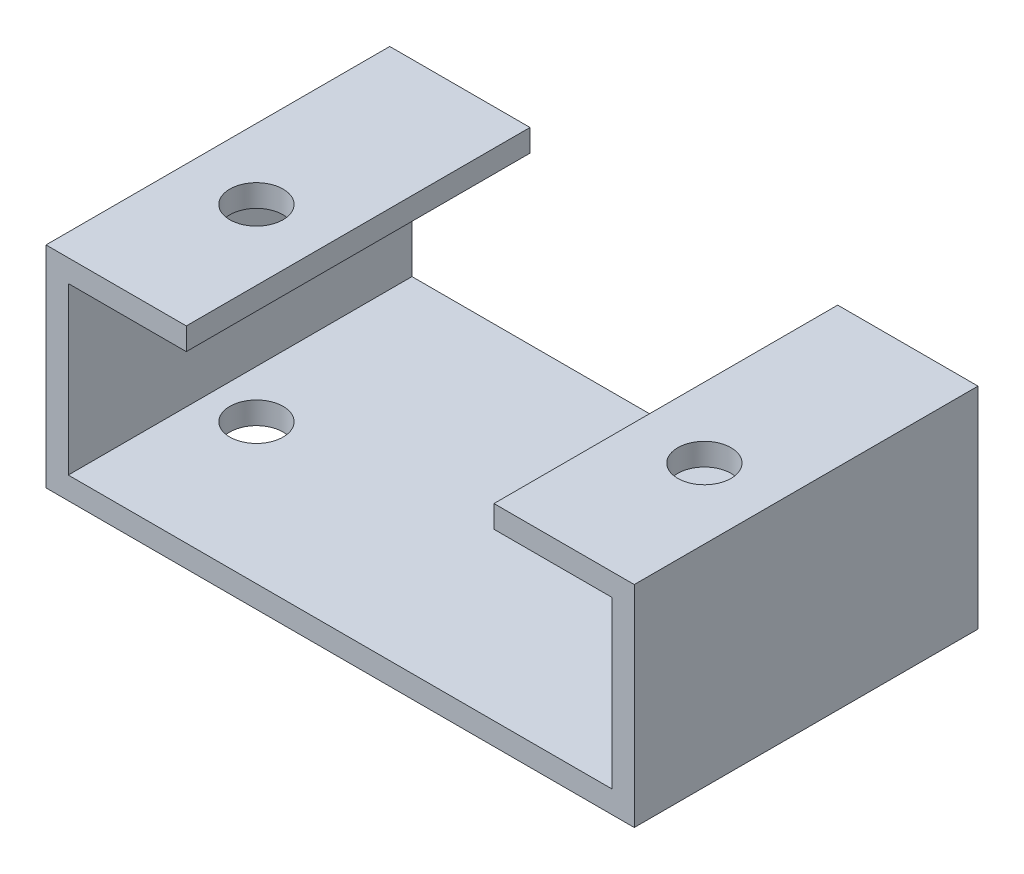
ISO-10303-21;
HEADER;
FILE_DESCRIPTION(('STEP AP214'),'2;1');
FILE_NAME('part.step','',(''),(''),'','','');
FILE_SCHEMA(('AUTOMOTIVE_DESIGN { 1 0 10303 214 1 1 1 1 }'));
ENDSEC;
DATA;
#1=APPLICATION_CONTEXT('core data for automotive mechanical design processes');
#2=APPLICATION_PROTOCOL_DEFINITION('international standard','automotive_design',2000,#1);
#3=PRODUCT_CONTEXT('',#1,'mechanical');
#4=PRODUCT('Part','Part','',(#3));
#5=PRODUCT_RELATED_PRODUCT_CATEGORY('part','',(#4));
#6=PRODUCT_DEFINITION_FORMATION('','',#4);
#7=PRODUCT_DEFINITION_CONTEXT('part definition',#1,'design');
#8=PRODUCT_DEFINITION('design','',#6,#7);
#9=PRODUCT_DEFINITION_SHAPE('','',#8);
#10=(LENGTH_UNIT() NAMED_UNIT(*) SI_UNIT(.MILLI.,.METRE.));
#11=(NAMED_UNIT(*) PLANE_ANGLE_UNIT() SI_UNIT($,.RADIAN.));
#12=(NAMED_UNIT(*) SI_UNIT($,.STERADIAN.) SOLID_ANGLE_UNIT());
#13=UNCERTAINTY_MEASURE_WITH_UNIT(LENGTH_MEASURE(1.E-05),#10,'distance_accuracy_value','');
#14=(GEOMETRIC_REPRESENTATION_CONTEXT(3) GLOBAL_UNCERTAINTY_ASSIGNED_CONTEXT((#13)) GLOBAL_UNIT_ASSIGNED_CONTEXT((#10,
#11,#12)) REPRESENTATION_CONTEXT('',''));
#15=CARTESIAN_POINT('',(0.,0.,0.));
#16=DIRECTION('',(0.,0.,1.));
#17=DIRECTION('',(1.,0.,0.));
#18=AXIS2_PLACEMENT_3D('',#15,#16,#17);
#19=CARTESIAN_POINT('',(20.965,0.,-14.5));
#20=DIRECTION('',(0.,-1.,0.));
#21=DIRECTION('',(1.,0.,0.));
#22=AXIS2_PLACEMENT_3D('',#19,#20,#21);
#23=PLANE('',#22);
#24=CARTESIAN_POINT('',(36.93,0.,0.));
#25=DIRECTION('',(0.,-1.,0.));
#26=DIRECTION('',(0.,0.,-1.));
#27=AXIS2_PLACEMENT_3D('',#24,#25,#26);
#28=CIRCLE('',#27,1.89864999999999);
#29=CARTESIAN_POINT('',(36.93,0.,-1.89864999999999));
#30=VERTEX_POINT('',#29);
#31=EDGE_CURVE('E312',#30,#30,#28,.T.);
#32=ORIENTED_EDGE('',*,*,#31,.F.);
#33=EDGE_LOOP('',(#32));
#34=FACE_BOUND('',#33,.T.);
#35=CARTESIAN_POINT('',(5.,0.,0.));
#36=DIRECTION('',(0.,-1.,0.));
#37=DIRECTION('',(0.,0.,-1.));
#38=AXIS2_PLACEMENT_3D('',#35,#36,#37);
#39=CIRCLE('',#38,1.89864999999999);
#40=CARTESIAN_POINT('',(5.,0.,-1.89864999999999));
#41=VERTEX_POINT('',#40);
#42=EDGE_CURVE('E175',#41,#41,#39,.T.);
#43=ORIENTED_EDGE('',*,*,#42,.F.);
#44=EDGE_LOOP('',(#43));
#45=FACE_BOUND('',#44,.T.);
#46=DIRECTION('',(1.,0.,0.));
#47=VECTOR('',#46,1.);
#48=CARTESIAN_POINT('',(20.965,0.,-14.5));
#49=LINE('',#48,#47);
#50=CARTESIAN_POINT('',(0.,0.,-14.5));
#51=VERTEX_POINT('',#50);
#52=CARTESIAN_POINT('',(41.93,0.,-14.5));
#53=VERTEX_POINT('',#52);
#54=EDGE_CURVE('E137',#51,#53,#49,.T.);
#55=ORIENTED_EDGE('',*,*,#54,.T.);
#56=DIRECTION('',(0.,0.,1.));
#57=VECTOR('',#56,1.);
#58=CARTESIAN_POINT('',(41.93,0.,-14.5));
#59=LINE('',#58,#57);
#60=CARTESIAN_POINT('',(41.93,0.,10.));
#61=VERTEX_POINT('',#60);
#62=EDGE_CURVE('E135',#53,#61,#59,.T.);
#63=ORIENTED_EDGE('',*,*,#62,.T.);
#64=DIRECTION('',(1.,0.,0.));
#65=VECTOR('',#64,1.);
#66=CARTESIAN_POINT('',(20.965,0.,10.));
#67=LINE('',#66,#65);
#68=CARTESIAN_POINT('',(0.,0.,10.));
#69=VERTEX_POINT('',#68);
#70=EDGE_CURVE('E123',#69,#61,#67,.T.);
#71=ORIENTED_EDGE('',*,*,#70,.F.);
#72=DIRECTION('',(0.,0.,1.));
#73=VECTOR('',#72,1.);
#74=CARTESIAN_POINT('',(0.,0.,-14.5));
#75=LINE('',#74,#73);
#76=EDGE_CURVE('E11',#51,#69,#75,.T.);
#77=ORIENTED_EDGE('',*,*,#76,.F.);
#78=EDGE_LOOP('',(#55,#63,#71,#77));
#79=FACE_BOUND('',#78,.T.);
#80=ADVANCED_FACE('F35',(#34,#45,#79),#23,.T.);
#81=CARTESIAN_POINT('',(0.,0.,-14.5));
#82=DIRECTION('',(-1.,0.,0.));
#83=DIRECTION('',(0.,0.,1.));
#84=AXIS2_PLACEMENT_3D('',#81,#82,#83);
#85=PLANE('',#84);
#86=ORIENTED_EDGE('',*,*,#76,.T.);
#87=DIRECTION('',(0.,-1.,0.));
#88=VECTOR('',#87,1.);
#89=CARTESIAN_POINT('',(0.,0.,10.));
#90=LINE('',#89,#88);
#91=CARTESIAN_POINT('',(0.,15.,10.));
#92=VERTEX_POINT('',#91);
#93=EDGE_CURVE('E131',#92,#69,#90,.T.);
#94=ORIENTED_EDGE('',*,*,#93,.F.);
#95=DIRECTION('',(0.,0.,1.));
#96=VECTOR('',#95,1.);
#97=CARTESIAN_POINT('',(0.,15.,-14.5));
#98=LINE('',#97,#96);
#99=CARTESIAN_POINT('',(0.,15.,-14.5));
#100=VERTEX_POINT('',#99);
#101=EDGE_CURVE('E44',#100,#92,#98,.T.);
#102=ORIENTED_EDGE('',*,*,#101,.F.);
#103=DIRECTION('',(0.,-1.,0.));
#104=VECTOR('',#103,1.);
#105=CARTESIAN_POINT('',(0.,0.,-14.5));
#106=LINE('',#105,#104);
#107=EDGE_CURVE('E223',#100,#51,#106,.T.);
#108=ORIENTED_EDGE('',*,*,#107,.T.);
#109=EDGE_LOOP('',(#86,#94,#102,#108));
#110=FACE_BOUND('',#109,.T.);
#111=ADVANCED_FACE('F256',(#110),#85,.T.);
#112=CARTESIAN_POINT('',(0.,15.,-14.5));
#113=DIRECTION('',(0.,1.,0.));
#114=DIRECTION('',(0.,0.,1.));
#115=AXIS2_PLACEMENT_3D('',#112,#113,#114);
#116=PLANE('',#115);
#117=CARTESIAN_POINT('',(5.,15.,0.));
#118=DIRECTION('',(0.,-1.,0.));
#119=DIRECTION('',(0.,0.,-1.));
#120=AXIS2_PLACEMENT_3D('',#117,#118,#119);
#121=CIRCLE('',#120,1.89865);
#122=CARTESIAN_POINT('',(5.,15.,-1.89865));
#123=VERTEX_POINT('',#122);
#124=EDGE_CURVE('E185',#123,#123,#121,.T.);
#125=ORIENTED_EDGE('',*,*,#124,.T.);
#126=EDGE_LOOP('',(#125));
#127=FACE_BOUND('',#126,.T.);
#128=ORIENTED_EDGE('',*,*,#101,.T.);
#129=DIRECTION('',(-1.,0.,0.));
#130=VECTOR('',#129,1.);
#131=CARTESIAN_POINT('',(0.,15.,10.));
#132=LINE('',#131,#130);
#133=CARTESIAN_POINT('',(10.,15.,10.));
#134=VERTEX_POINT('',#133);
#135=EDGE_CURVE('E206',#134,#92,#132,.T.);
#136=ORIENTED_EDGE('',*,*,#135,.F.);
#137=DIRECTION('',(0.,0.,1.));
#138=VECTOR('',#137,1.);
#139=CARTESIAN_POINT('',(10.,15.,-14.5));
#140=LINE('',#139,#138);
#141=CARTESIAN_POINT('',(10.,15.,-14.5));
#142=VERTEX_POINT('',#141);
#143=EDGE_CURVE('E228',#142,#134,#140,.T.);
#144=ORIENTED_EDGE('',*,*,#143,.F.);
#145=DIRECTION('',(-1.,0.,0.));
#146=VECTOR('',#145,1.);
#147=CARTESIAN_POINT('',(0.,15.,-14.5));
#148=LINE('',#147,#146);
#149=EDGE_CURVE('E220',#142,#100,#148,.T.);
#150=ORIENTED_EDGE('',*,*,#149,.T.);
#151=EDGE_LOOP('',(#128,#136,#144,#150));
#152=FACE_BOUND('',#151,.T.);
#153=ADVANCED_FACE('F254',(#127,#152),#116,.T.);
#154=CARTESIAN_POINT('',(10.,15.,-14.5));
#155=DIRECTION('',(1.,0.,0.));
#156=DIRECTION('',(0.,0.,-1.));
#157=AXIS2_PLACEMENT_3D('',#154,#155,#156);
#158=PLANE('',#157);
#159=ORIENTED_EDGE('',*,*,#143,.T.);
#160=DIRECTION('',(0.,1.,0.));
#161=VECTOR('',#160,1.);
#162=CARTESIAN_POINT('',(10.,15.,10.));
#163=LINE('',#162,#161);
#164=CARTESIAN_POINT('',(10.,13.4125,10.));
#165=VERTEX_POINT('',#164);
#166=EDGE_CURVE('E203',#165,#134,#163,.T.);
#167=ORIENTED_EDGE('',*,*,#166,.F.);
#168=DIRECTION('',(0.,0.,1.));
#169=VECTOR('',#168,1.);
#170=CARTESIAN_POINT('',(10.,13.4125,-14.5));
#171=LINE('',#170,#169);
#172=CARTESIAN_POINT('',(10.,13.4125,-14.5));
#173=VERTEX_POINT('',#172);
#174=EDGE_CURVE('E230',#173,#165,#171,.T.);
#175=ORIENTED_EDGE('',*,*,#174,.F.);
#176=DIRECTION('',(0.,1.,0.));
#177=VECTOR('',#176,1.);
#178=CARTESIAN_POINT('',(10.,15.,-14.5));
#179=LINE('',#178,#177);
#180=EDGE_CURVE('E217',#173,#142,#179,.T.);
#181=ORIENTED_EDGE('',*,*,#180,.T.);
#182=EDGE_LOOP('',(#159,#167,#175,#181));
#183=FACE_BOUND('',#182,.T.);
#184=ADVANCED_FACE('F250',(#183),#158,.T.);
#185=CARTESIAN_POINT('',(1.5875,13.4125,-14.5));
#186=DIRECTION('',(0.,-1.,0.));
#187=DIRECTION('',(0.,0.,-1.));
#188=AXIS2_PLACEMENT_3D('',#185,#186,#187);
#189=PLANE('',#188);
#190=CARTESIAN_POINT('',(5.,13.4125,0.));
#191=DIRECTION('',(0.,-1.,0.));
#192=DIRECTION('',(0.,0.,-1.));
#193=AXIS2_PLACEMENT_3D('',#190,#191,#192);
#194=CIRCLE('',#193,1.89864999999999);
#195=CARTESIAN_POINT('',(5.,13.4125,-1.89864999999999));
#196=VERTEX_POINT('',#195);
#197=EDGE_CURVE('E191',#196,#196,#194,.T.);
#198=ORIENTED_EDGE('',*,*,#197,.F.);
#199=EDGE_LOOP('',(#198));
#200=FACE_BOUND('',#199,.T.);
#201=ORIENTED_EDGE('',*,*,#174,.T.);
#202=DIRECTION('',(1.,0.,0.));
#203=VECTOR('',#202,1.);
#204=CARTESIAN_POINT('',(1.5875,13.4125,10.));
#205=LINE('',#204,#203);
#206=CARTESIAN_POINT('',(1.5875,13.4125,10.));
#207=VERTEX_POINT('',#206);
#208=EDGE_CURVE('E200',#207,#165,#205,.T.);
#209=ORIENTED_EDGE('',*,*,#208,.F.);
#210=DIRECTION('',(0.,0.,1.));
#211=VECTOR('',#210,1.);
#212=CARTESIAN_POINT('',(1.5875,13.4125,-14.5));
#213=LINE('',#212,#211);
#214=CARTESIAN_POINT('',(1.5875,13.4125,-14.5));
#215=VERTEX_POINT('',#214);
#216=EDGE_CURVE('E232',#215,#207,#213,.T.);
#217=ORIENTED_EDGE('',*,*,#216,.F.);
#218=DIRECTION('',(1.,0.,0.));
#219=VECTOR('',#218,1.);
#220=CARTESIAN_POINT('',(1.5875,13.4125,-14.5));
#221=LINE('',#220,#219);
#222=EDGE_CURVE('E214',#215,#173,#221,.T.);
#223=ORIENTED_EDGE('',*,*,#222,.T.);
#224=EDGE_LOOP('',(#201,#209,#217,#223));
#225=FACE_BOUND('',#224,.T.);
#226=ADVANCED_FACE('F244',(#200,#225),#189,.T.);
#227=CARTESIAN_POINT('',(1.5875,1.5875,-14.5));
#228=DIRECTION('',(1.,0.,0.));
#229=DIRECTION('',(0.,0.,-1.));
#230=AXIS2_PLACEMENT_3D('',#227,#228,#229);
#231=PLANE('',#230);
#232=ORIENTED_EDGE('',*,*,#216,.T.);
#233=DIRECTION('',(0.,1.,0.));
#234=VECTOR('',#233,1.);
#235=CARTESIAN_POINT('',(1.5875,1.5875,10.));
#236=LINE('',#235,#234);
#237=CARTESIAN_POINT('',(1.5875,1.5875,10.));
#238=VERTEX_POINT('',#237);
#239=EDGE_CURVE('E197',#238,#207,#236,.T.);
#240=ORIENTED_EDGE('',*,*,#239,.F.);
#241=DIRECTION('',(0.,0.,1.));
#242=VECTOR('',#241,1.);
#243=CARTESIAN_POINT('',(1.5875,1.5875,-14.5));
#244=LINE('',#243,#242);
#245=CARTESIAN_POINT('',(1.5875,1.5875,-14.5));
#246=VERTEX_POINT('',#245);
#247=EDGE_CURVE('E225',#246,#238,#244,.T.);
#248=ORIENTED_EDGE('',*,*,#247,.F.);
#249=DIRECTION('',(0.,1.,0.));
#250=VECTOR('',#249,1.);
#251=CARTESIAN_POINT('',(1.5875,1.5875,-14.5));
#252=LINE('',#251,#250);
#253=EDGE_CURVE('E211',#246,#215,#252,.T.);
#254=ORIENTED_EDGE('',*,*,#253,.T.);
#255=EDGE_LOOP('',(#232,#240,#248,#254));
#256=FACE_BOUND('',#255,.T.);
#257=ADVANCED_FACE('F241',(#256),#231,.T.);
#258=CARTESIAN_POINT('',(20.965,1.5875,-14.5));
#259=DIRECTION('',(0.,1.,0.));
#260=DIRECTION('',(-1.,0.,0.));
#261=AXIS2_PLACEMENT_3D('',#258,#259,#260);
#262=PLANE('',#261);
#263=CARTESIAN_POINT('',(36.93,1.5875,0.));
#264=DIRECTION('',(0.,1.,0.));
#265=DIRECTION('',(-1.,0.,0.));
#266=AXIS2_PLACEMENT_3D('',#263,#264,#265);
#267=CIRCLE('',#266,1.89864999999999);
#268=CARTESIAN_POINT('',(35.03135,1.5875,0.));
#269=VERTEX_POINT('',#268);
#270=EDGE_CURVE('E39',#269,#269,#267,.T.);
#271=ORIENTED_EDGE('',*,*,#270,.F.);
#272=EDGE_LOOP('',(#271));
#273=FACE_BOUND('',#272,.T.);
#274=CARTESIAN_POINT('',(5.,1.5875,0.));
#275=DIRECTION('',(0.,1.,0.));
#276=DIRECTION('',(-1.,0.,0.));
#277=AXIS2_PLACEMENT_3D('',#274,#275,#276);
#278=CIRCLE('',#277,1.89864999999999);
#279=CARTESIAN_POINT('',(3.10135000000001,1.5875,0.));
#280=VERTEX_POINT('',#279);
#281=EDGE_CURVE('E188',#280,#280,#278,.T.);
#282=ORIENTED_EDGE('',*,*,#281,.F.);
#283=EDGE_LOOP('',(#282));
#284=FACE_BOUND('',#283,.T.);
#285=ORIENTED_EDGE('',*,*,#247,.T.);
#286=DIRECTION('',(-1.,0.,0.));
#287=VECTOR('',#286,1.);
#288=CARTESIAN_POINT('',(20.965,1.5875,10.));
#289=LINE('',#288,#287);
#290=CARTESIAN_POINT('',(40.3425,1.5875,10.));
#291=VERTEX_POINT('',#290);
#292=EDGE_CURVE('E194',#291,#238,#289,.T.);
#293=ORIENTED_EDGE('',*,*,#292,.F.);
#294=DIRECTION('',(0.,0.,1.));
#295=VECTOR('',#294,1.);
#296=CARTESIAN_POINT('',(40.3425,1.5875,-14.5));
#297=LINE('',#296,#295);
#298=CARTESIAN_POINT('',(40.3425,1.5875,-14.5));
#299=VERTEX_POINT('',#298);
#300=EDGE_CURVE('E172',#299,#291,#297,.T.);
#301=ORIENTED_EDGE('',*,*,#300,.F.);
#302=DIRECTION('',(-1.,0.,0.));
#303=VECTOR('',#302,1.);
#304=CARTESIAN_POINT('',(20.965,1.5875,-14.5));
#305=LINE('',#304,#303);
#306=EDGE_CURVE('E132',#299,#246,#305,.T.);
#307=ORIENTED_EDGE('',*,*,#306,.T.);
#308=EDGE_LOOP('',(#285,#293,#301,#307));
#309=FACE_BOUND('',#308,.T.);
#310=ADVANCED_FACE('F37',(#273,#284,#309),#262,.T.);
#311=CARTESIAN_POINT('',(0.,0.,-14.5));
#312=DIRECTION('',(0.,0.,-1.));
#313=DIRECTION('',(-1.,0.,0.));
#314=AXIS2_PLACEMENT_3D('',#311,#312,#313);
#315=PLANE('',#314);
#316=ORIENTED_EDGE('',*,*,#306,.F.);
#317=DIRECTION('',(0.,1.,0.));
#318=VECTOR('',#317,1.);
#319=CARTESIAN_POINT('',(40.3425,1.5875,-14.5));
#320=LINE('',#319,#318);
#321=CARTESIAN_POINT('',(40.3425,13.4125,-14.5));
#322=VERTEX_POINT('',#321);
#323=EDGE_CURVE('E142',#299,#322,#320,.T.);
#324=ORIENTED_EDGE('',*,*,#323,.T.);
#325=DIRECTION('',(-1.,0.,0.));
#326=VECTOR('',#325,1.);
#327=CARTESIAN_POINT('',(40.3425,13.4125,-14.5));
#328=LINE('',#327,#326);
#329=CARTESIAN_POINT('',(31.93,13.4125,-14.5));
#330=VERTEX_POINT('',#329);
#331=EDGE_CURVE('E169',#322,#330,#328,.T.);
#332=ORIENTED_EDGE('',*,*,#331,.T.);
#333=DIRECTION('',(0.,1.,0.));
#334=VECTOR('',#333,1.);
#335=CARTESIAN_POINT('',(31.93,15.,-14.5));
#336=LINE('',#335,#334);
#337=CARTESIAN_POINT('',(31.93,15.,-14.5));
#338=VERTEX_POINT('',#337);
#339=EDGE_CURVE('E167',#330,#338,#336,.T.);
#340=ORIENTED_EDGE('',*,*,#339,.T.);
#341=DIRECTION('',(1.,0.,0.));
#342=VECTOR('',#341,1.);
#343=CARTESIAN_POINT('',(41.93,15.,-14.5));
#344=LINE('',#343,#342);
#345=CARTESIAN_POINT('',(41.93,15.,-14.5));
#346=VERTEX_POINT('',#345);
#347=EDGE_CURVE('E165',#338,#346,#344,.T.);
#348=ORIENTED_EDGE('',*,*,#347,.T.);
#349=DIRECTION('',(0.,-1.,0.));
#350=VECTOR('',#349,1.);
#351=CARTESIAN_POINT('',(41.93,0.,-14.5));
#352=LINE('',#351,#350);
#353=EDGE_CURVE('E163',#346,#53,#352,.T.);
#354=ORIENTED_EDGE('',*,*,#353,.T.);
#355=ORIENTED_EDGE('',*,*,#54,.F.);
#356=ORIENTED_EDGE('',*,*,#107,.F.);
#357=ORIENTED_EDGE('',*,*,#149,.F.);
#358=ORIENTED_EDGE('',*,*,#180,.F.);
#359=ORIENTED_EDGE('',*,*,#222,.F.);
#360=ORIENTED_EDGE('',*,*,#253,.F.);
#361=EDGE_LOOP('',(#316,#324,#332,#340,#348,#354,#355,#356,#357,#358,#359,#360));
#362=FACE_BOUND('',#361,.T.);
#363=ADVANCED_FACE('F247',(#362),#315,.T.);
#364=CARTESIAN_POINT('',(0.,0.,10.));
#365=DIRECTION('',(0.,0.,-1.));
#366=DIRECTION('',(-1.,0.,0.));
#367=AXIS2_PLACEMENT_3D('',#364,#365,#366);
#368=PLANE('',#367);
#369=ORIENTED_EDGE('',*,*,#70,.T.);
#370=DIRECTION('',(0.,-1.,0.));
#371=VECTOR('',#370,1.);
#372=CARTESIAN_POINT('',(41.93,0.,10.));
#373=LINE('',#372,#371);
#374=CARTESIAN_POINT('',(41.93,15.,10.));
#375=VERTEX_POINT('',#374);
#376=EDGE_CURVE('E128',#375,#61,#373,.T.);
#377=ORIENTED_EDGE('',*,*,#376,.F.);
#378=DIRECTION('',(1.,0.,0.));
#379=VECTOR('',#378,1.);
#380=CARTESIAN_POINT('',(41.93,15.,10.));
#381=LINE('',#380,#379);
#382=CARTESIAN_POINT('',(31.93,15.,10.));
#383=VERTEX_POINT('',#382);
#384=EDGE_CURVE('E146',#383,#375,#381,.T.);
#385=ORIENTED_EDGE('',*,*,#384,.F.);
#386=DIRECTION('',(0.,1.,0.));
#387=VECTOR('',#386,1.);
#388=CARTESIAN_POINT('',(31.93,15.,10.));
#389=LINE('',#388,#387);
#390=CARTESIAN_POINT('',(31.93,13.4125,10.));
#391=VERTEX_POINT('',#390);
#392=EDGE_CURVE('E149',#391,#383,#389,.T.);
#393=ORIENTED_EDGE('',*,*,#392,.F.);
#394=DIRECTION('',(-1.,0.,0.));
#395=VECTOR('',#394,1.);
#396=CARTESIAN_POINT('',(40.3425,13.4125,10.));
#397=LINE('',#396,#395);
#398=CARTESIAN_POINT('',(40.3425,13.4125,10.));
#399=VERTEX_POINT('',#398);
#400=EDGE_CURVE('E157',#399,#391,#397,.T.);
#401=ORIENTED_EDGE('',*,*,#400,.F.);
#402=DIRECTION('',(0.,1.,0.));
#403=VECTOR('',#402,1.);
#404=CARTESIAN_POINT('',(40.3425,1.5875,10.));
#405=LINE('',#404,#403);
#406=EDGE_CURVE('E160',#291,#399,#405,.T.);
#407=ORIENTED_EDGE('',*,*,#406,.F.);
#408=ORIENTED_EDGE('',*,*,#292,.T.);
#409=ORIENTED_EDGE('',*,*,#239,.T.);
#410=ORIENTED_EDGE('',*,*,#208,.T.);
#411=ORIENTED_EDGE('',*,*,#166,.T.);
#412=ORIENTED_EDGE('',*,*,#135,.T.);
#413=ORIENTED_EDGE('',*,*,#93,.T.);
#414=EDGE_LOOP('',(#369,#377,#385,#393,#401,#407,#408,#409,#410,#411,#412,#413));
#415=FACE_BOUND('',#414,.T.);
#416=ADVANCED_FACE('F125',(#415),#368,.F.);
#417=CARTESIAN_POINT('',(5.,0.,0.));
#418=DIRECTION('',(0.,-1.,0.));
#419=DIRECTION('',(0.,0.,-1.));
#420=AXIS2_PLACEMENT_3D('',#417,#418,#419);
#421=CYLINDRICAL_SURFACE('',#420,1.89864999999999);
#422=ORIENTED_EDGE('',*,*,#281,.T.);
#423=EDGE_LOOP('',(#422));
#424=FACE_BOUND('',#423,.T.);
#425=ORIENTED_EDGE('',*,*,#42,.T.);
#426=EDGE_LOOP('',(#425));
#427=FACE_BOUND('',#426,.T.);
#428=ADVANCED_FACE('F277',(#424,#427),#421,.F.);
#429=ORIENTED_EDGE('',*,*,#197,.T.);
#430=EDGE_LOOP('',(#429));
#431=FACE_BOUND('',#430,.T.);
#432=ORIENTED_EDGE('',*,*,#124,.F.);
#433=EDGE_LOOP('',(#432));
#434=FACE_BOUND('',#433,.T.);
#435=ADVANCED_FACE('F280',(#431,#434),#421,.F.);
#436=CARTESIAN_POINT('',(40.3425,1.5875,-14.5));
#437=DIRECTION('',(1.,0.,0.));
#438=DIRECTION('',(0.,0.,-1.));
#439=AXIS2_PLACEMENT_3D('',#436,#437,#438);
#440=PLANE('',#439);
#441=ORIENTED_EDGE('',*,*,#300,.T.);
#442=ORIENTED_EDGE('',*,*,#406,.T.);
#443=DIRECTION('',(0.,0.,1.));
#444=VECTOR('',#443,1.);
#445=CARTESIAN_POINT('',(40.3425,13.4125,-14.5));
#446=LINE('',#445,#444);
#447=EDGE_CURVE('E176',#322,#399,#446,.T.);
#448=ORIENTED_EDGE('',*,*,#447,.F.);
#449=ORIENTED_EDGE('',*,*,#323,.F.);
#450=EDGE_LOOP('',(#441,#442,#448,#449));
#451=FACE_BOUND('',#450,.T.);
#452=ADVANCED_FACE('F296',(#451),#440,.F.);
#453=CARTESIAN_POINT('',(40.3425,13.4125,-14.5));
#454=DIRECTION('',(0.,1.,0.));
#455=DIRECTION('',(0.,0.,1.));
#456=AXIS2_PLACEMENT_3D('',#453,#454,#455);
#457=PLANE('',#456);
#458=CARTESIAN_POINT('',(36.93,13.4125,0.));
#459=DIRECTION('',(0.,1.,0.));
#460=DIRECTION('',(0.,0.,1.));
#461=AXIS2_PLACEMENT_3D('',#458,#459,#460);
#462=CIRCLE('',#461,1.89864999999999);
#463=CARTESIAN_POINT('',(36.93,13.4125,1.89864999999999));
#464=VERTEX_POINT('',#463);
#465=EDGE_CURVE('E147',#464,#464,#462,.T.);
#466=ORIENTED_EDGE('',*,*,#465,.T.);
#467=EDGE_LOOP('',(#466));
#468=FACE_BOUND('',#467,.T.);
#469=ORIENTED_EDGE('',*,*,#447,.T.);
#470=ORIENTED_EDGE('',*,*,#400,.T.);
#471=DIRECTION('',(0.,0.,1.));
#472=VECTOR('',#471,1.);
#473=CARTESIAN_POINT('',(31.93,13.4125,-14.5));
#474=LINE('',#473,#472);
#475=EDGE_CURVE('E178',#330,#391,#474,.T.);
#476=ORIENTED_EDGE('',*,*,#475,.F.);
#477=ORIENTED_EDGE('',*,*,#331,.F.);
#478=EDGE_LOOP('',(#469,#470,#476,#477));
#479=FACE_BOUND('',#478,.T.);
#480=ADVANCED_FACE('F292',(#468,#479),#457,.F.);
#481=CARTESIAN_POINT('',(31.93,15.,-14.5));
#482=DIRECTION('',(1.,0.,0.));
#483=DIRECTION('',(0.,0.,-1.));
#484=AXIS2_PLACEMENT_3D('',#481,#482,#483);
#485=PLANE('',#484);
#486=ORIENTED_EDGE('',*,*,#475,.T.);
#487=ORIENTED_EDGE('',*,*,#392,.T.);
#488=DIRECTION('',(0.,0.,1.));
#489=VECTOR('',#488,1.);
#490=CARTESIAN_POINT('',(31.93,15.,-14.5));
#491=LINE('',#490,#489);
#492=EDGE_CURVE('E180',#338,#383,#491,.T.);
#493=ORIENTED_EDGE('',*,*,#492,.F.);
#494=ORIENTED_EDGE('',*,*,#339,.F.);
#495=EDGE_LOOP('',(#486,#487,#493,#494));
#496=FACE_BOUND('',#495,.T.);
#497=ADVANCED_FACE('F288',(#496),#485,.F.);
#498=CARTESIAN_POINT('',(41.93,15.,-14.5));
#499=DIRECTION('',(0.,-1.,0.));
#500=DIRECTION('',(0.,0.,-1.));
#501=AXIS2_PLACEMENT_3D('',#498,#499,#500);
#502=PLANE('',#501);
#503=CARTESIAN_POINT('',(36.93,15.,0.));
#504=DIRECTION('',(0.,-1.,0.));
#505=DIRECTION('',(0.,0.,-1.));
#506=AXIS2_PLACEMENT_3D('',#503,#504,#505);
#507=CIRCLE('',#506,1.89864999999999);
#508=CARTESIAN_POINT('',(36.93,15.,-1.89864999999999));
#509=VERTEX_POINT('',#508);
#510=EDGE_CURVE('E313',#509,#509,#507,.T.);
#511=ORIENTED_EDGE('',*,*,#510,.T.);
#512=EDGE_LOOP('',(#511));
#513=FACE_BOUND('',#512,.T.);
#514=ORIENTED_EDGE('',*,*,#492,.T.);
#515=ORIENTED_EDGE('',*,*,#384,.T.);
#516=DIRECTION('',(0.,0.,1.));
#517=VECTOR('',#516,1.);
#518=CARTESIAN_POINT('',(41.93,15.,-14.5));
#519=LINE('',#518,#517);
#520=EDGE_CURVE('E141',#346,#375,#519,.T.);
#521=ORIENTED_EDGE('',*,*,#520,.F.);
#522=ORIENTED_EDGE('',*,*,#347,.F.);
#523=EDGE_LOOP('',(#514,#515,#521,#522));
#524=FACE_BOUND('',#523,.T.);
#525=ADVANCED_FACE('F285',(#513,#524),#502,.F.);
#526=CARTESIAN_POINT('',(41.93,0.,-14.5));
#527=DIRECTION('',(-1.,0.,0.));
#528=DIRECTION('',(0.,0.,1.));
#529=AXIS2_PLACEMENT_3D('',#526,#527,#528);
#530=PLANE('',#529);
#531=ORIENTED_EDGE('',*,*,#520,.T.);
#532=ORIENTED_EDGE('',*,*,#376,.T.);
#533=ORIENTED_EDGE('',*,*,#62,.F.);
#534=ORIENTED_EDGE('',*,*,#353,.F.);
#535=EDGE_LOOP('',(#531,#532,#533,#534));
#536=FACE_BOUND('',#535,.T.);
#537=ADVANCED_FACE('F144',(#536),#530,.F.);
#538=CARTESIAN_POINT('',(36.93,0.,0.));
#539=DIRECTION('',(0.,-1.,0.));
#540=DIRECTION('',(0.,0.,-1.));
#541=AXIS2_PLACEMENT_3D('',#538,#539,#540);
#542=CYLINDRICAL_SURFACE('',#541,1.89864999999999);
#543=ORIENTED_EDGE('',*,*,#270,.T.);
#544=EDGE_LOOP('',(#543));
#545=FACE_BOUND('',#544,.T.);
#546=ORIENTED_EDGE('',*,*,#31,.T.);
#547=EDGE_LOOP('',(#546));
#548=FACE_BOUND('',#547,.T.);
#549=ADVANCED_FACE('F284',(#545,#548),#542,.F.);
#550=ORIENTED_EDGE('',*,*,#510,.F.);
#551=EDGE_LOOP('',(#550));
#552=FACE_BOUND('',#551,.T.);
#553=ORIENTED_EDGE('',*,*,#465,.F.);
#554=EDGE_LOOP('',(#553));
#555=FACE_BOUND('',#554,.T.);
#556=ADVANCED_FACE('F302',(#552,#555),#542,.F.);
#557=CLOSED_SHELL('',(#80,#111,#153,#184,#226,#257,#310,#363,#416,#428,#435,#452,#480,#497,#525,
#537,#549,#556));
#558=MANIFOLD_SOLID_BREP('B2',#557);
#559=ADVANCED_BREP_SHAPE_REPRESENTATION('',(#18,#558),#14);
#560=SHAPE_DEFINITION_REPRESENTATION(#9,#559);
ENDSEC;
END-ISO-10303-21;
